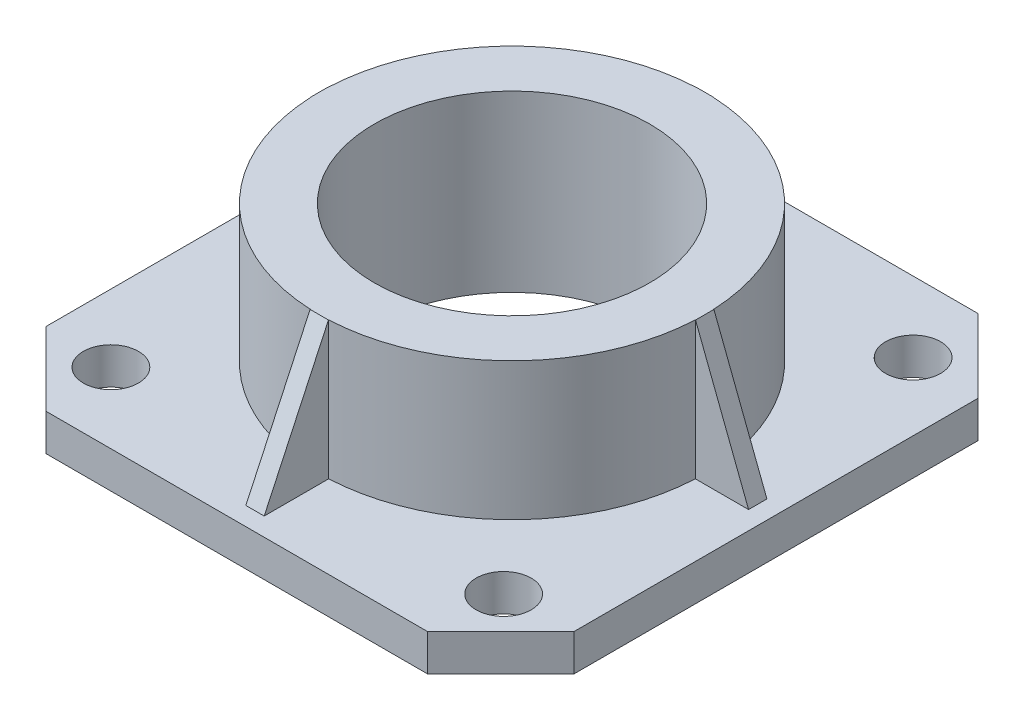
ISO-10303-21;
HEADER;
FILE_DESCRIPTION(('STEP AP214'),'2;1');
FILE_NAME('part.step','',(''),(''),'','','');
FILE_SCHEMA(('AUTOMOTIVE_DESIGN { 1 0 10303 214 1 1 1 1 }'));
ENDSEC;
DATA;
#1=APPLICATION_CONTEXT('core data for automotive mechanical design processes');
#2=APPLICATION_PROTOCOL_DEFINITION('international standard','automotive_design',2000,#1);
#3=PRODUCT_CONTEXT('',#1,'mechanical');
#4=PRODUCT('Part','Part','',(#3));
#5=PRODUCT_RELATED_PRODUCT_CATEGORY('part','',(#4));
#6=PRODUCT_DEFINITION_FORMATION('','',#4);
#7=PRODUCT_DEFINITION_CONTEXT('part definition',#1,'design');
#8=PRODUCT_DEFINITION('design','',#6,#7);
#9=PRODUCT_DEFINITION_SHAPE('','',#8);
#10=(LENGTH_UNIT() NAMED_UNIT(*) SI_UNIT(.MILLI.,.METRE.));
#11=(NAMED_UNIT(*) PLANE_ANGLE_UNIT() SI_UNIT($,.RADIAN.));
#12=(NAMED_UNIT(*) SI_UNIT($,.STERADIAN.) SOLID_ANGLE_UNIT());
#13=UNCERTAINTY_MEASURE_WITH_UNIT(LENGTH_MEASURE(1.E-05),#10,'distance_accuracy_value','');
#14=(GEOMETRIC_REPRESENTATION_CONTEXT(3) GLOBAL_UNCERTAINTY_ASSIGNED_CONTEXT((#13)) GLOBAL_UNIT_ASSIGNED_CONTEXT((#10,
#11,#12)) REPRESENTATION_CONTEXT('',''));
#15=CARTESIAN_POINT('',(0.,0.,0.));
#16=DIRECTION('',(0.,0.,1.));
#17=DIRECTION('',(1.,0.,0.));
#18=AXIS2_PLACEMENT_3D('',#15,#16,#17);
#19=CARTESIAN_POINT('',(0.,9.5,0.));
#20=DIRECTION('',(0.,-1.,0.));
#21=DIRECTION('',(0.,0.,-1.));
#22=AXIS2_PLACEMENT_3D('',#19,#20,#21);
#23=CYLINDRICAL_SURFACE('',#22,10.5);
#24=DIRECTION('',(0.,-1.,0.));
#25=VECTOR('',#24,1.);
#26=CARTESIAN_POINT('',(10.4880884817015,9.5,-0.5));
#27=LINE('',#26,#25);
#28=CARTESIAN_POINT('',(10.4880884817015,2.,-0.5));
#29=VERTEX_POINT('',#28);
#30=CARTESIAN_POINT('',(10.4880884817015,9.5,-0.5));
#31=VERTEX_POINT('',#30);
#32=EDGE_CURVE('E219',#29,#31,#27,.F.);
#33=ORIENTED_EDGE('',*,*,#32,.F.);
#34=CARTESIAN_POINT('',(0.,2.,0.));
#35=DIRECTION('',(0.,-1.,0.));
#36=DIRECTION('',(0.,0.,-1.));
#37=AXIS2_PLACEMENT_3D('',#34,#35,#36);
#38=CIRCLE('',#37,10.5);
#39=CARTESIAN_POINT('',(0.5,2.,-10.4880884817015));
#40=VERTEX_POINT('',#39);
#41=EDGE_CURVE('E390',#29,#40,#38,.F.);
#42=ORIENTED_EDGE('',*,*,#41,.T.);
#43=DIRECTION('',(0.,-1.,0.));
#44=VECTOR('',#43,1.);
#45=CARTESIAN_POINT('',(0.5,9.5,-10.4880884817015));
#46=LINE('',#45,#44);
#47=CARTESIAN_POINT('',(0.5,9.5,-10.4880884817015));
#48=VERTEX_POINT('',#47);
#49=EDGE_CURVE('E41',#40,#48,#46,.F.);
#50=ORIENTED_EDGE('',*,*,#49,.T.);
#51=CARTESIAN_POINT('',(0.,9.5,0.));
#52=DIRECTION('',(0.,1.,0.));
#53=DIRECTION('',(0.,0.,1.));
#54=AXIS2_PLACEMENT_3D('',#51,#52,#53);
#55=CIRCLE('',#54,10.5);
#56=EDGE_CURVE('E299',#31,#48,#55,.T.);
#57=ORIENTED_EDGE('',*,*,#56,.F.);
#58=EDGE_LOOP('',(#33,#42,#50,#57));
#59=FACE_BOUND('',#58,.T.);
#60=ADVANCED_FACE('F33',(#59),#23,.T.);
#61=CARTESIAN_POINT('',(-14.3876477930347,2.,-15.));
#62=DIRECTION('',(0.,-1.,0.));
#63=DIRECTION('',(0.,0.,-1.));
#64=AXIS2_PLACEMENT_3D('',#61,#62,#63);
#65=PLANE('',#64);
#66=CARTESIAN_POINT('',(10.6983900295492,2.,11.1537238575528));
#67=DIRECTION('',(0.,1.,0.));
#68=DIRECTION('',(0.,0.,1.));
#69=AXIS2_PLACEMENT_3D('',#66,#67,#68);
#70=CIRCLE('',#69,1.5);
#71=CARTESIAN_POINT('',(10.6983900295492,2.,12.6537238575528));
#72=VERTEX_POINT('',#71);
#73=EDGE_CURVE('E306',#72,#72,#70,.T.);
#74=ORIENTED_EDGE('',*,*,#73,.F.);
#75=EDGE_LOOP('',(#74));
#76=FACE_BOUND('',#75,.T.);
#77=CARTESIAN_POINT('',(-10.6983900295492,2.,-11.1537238575528));
#78=DIRECTION('',(0.,1.,0.));
#79=DIRECTION('',(0.,0.,1.));
#80=AXIS2_PLACEMENT_3D('',#77,#78,#79);
#81=CIRCLE('',#80,1.5);
#82=CARTESIAN_POINT('',(-10.6983900295492,2.,-9.65372385755277));
#83=VERTEX_POINT('',#82);
#84=EDGE_CURVE('E318',#83,#83,#81,.T.);
#85=ORIENTED_EDGE('',*,*,#84,.F.);
#86=EDGE_LOOP('',(#85));
#87=FACE_BOUND('',#86,.T.);
#88=DIRECTION('',(0.,0.,1.));
#89=VECTOR('',#88,1.);
#90=CARTESIAN_POINT('',(-14.3876477930347,2.,11.));
#91=LINE('',#90,#89);
#92=CARTESIAN_POINT('',(-14.3876477930347,2.,-11.));
#93=VERTEX_POINT('',#92);
#94=CARTESIAN_POINT('',(-14.3876477930347,2.,11.));
#95=VERTEX_POINT('',#94);
#96=EDGE_CURVE('E333',#93,#95,#91,.T.);
#97=ORIENTED_EDGE('',*,*,#96,.T.);
#98=DIRECTION('',(0.707106781186548,0.,0.707106781186548));
#99=VECTOR('',#98,1.);
#100=CARTESIAN_POINT('',(-14.3876477930347,2.,11.));
#101=LINE('',#100,#99);
#102=CARTESIAN_POINT('',(-10.3876477930347,2.,15.));
#103=VERTEX_POINT('',#102);
#104=EDGE_CURVE('E336',#95,#103,#101,.T.);
#105=ORIENTED_EDGE('',*,*,#104,.T.);
#106=DIRECTION('',(1.,0.,0.));
#107=VECTOR('',#106,1.);
#108=CARTESIAN_POINT('',(-10.3876477930347,2.,15.));
#109=LINE('',#108,#107);
#110=CARTESIAN_POINT('',(10.3876477930347,2.,15.));
#111=VERTEX_POINT('',#110);
#112=EDGE_CURVE('E339',#103,#111,#109,.T.);
#113=ORIENTED_EDGE('',*,*,#112,.T.);
#114=DIRECTION('',(0.707106781186548,0.,-0.707106781186548));
#115=VECTOR('',#114,1.);
#116=CARTESIAN_POINT('',(10.3876477930347,2.,15.));
#117=LINE('',#116,#115);
#118=CARTESIAN_POINT('',(14.3876477930347,2.,11.));
#119=VERTEX_POINT('',#118);
#120=EDGE_CURVE('E341',#111,#119,#117,.T.);
#121=ORIENTED_EDGE('',*,*,#120,.T.);
#122=DIRECTION('',(0.,0.,-1.));
#123=VECTOR('',#122,1.);
#124=CARTESIAN_POINT('',(14.3876477930347,2.,11.));
#125=LINE('',#124,#123);
#126=CARTESIAN_POINT('',(14.3876477930347,2.,-11.));
#127=VERTEX_POINT('',#126);
#128=EDGE_CURVE('E343',#119,#127,#125,.T.);
#129=ORIENTED_EDGE('',*,*,#128,.T.);
#130=DIRECTION('',(-0.707106781186548,0.,-0.707106781186548));
#131=VECTOR('',#130,1.);
#132=CARTESIAN_POINT('',(10.3876477930347,2.,-15.));
#133=LINE('',#132,#131);
#134=CARTESIAN_POINT('',(10.3876477930347,2.,-15.));
#135=VERTEX_POINT('',#134);
#136=EDGE_CURVE('E345',#127,#135,#133,.T.);
#137=ORIENTED_EDGE('',*,*,#136,.T.);
#138=DIRECTION('',(-1.,0.,0.));
#139=VECTOR('',#138,1.);
#140=CARTESIAN_POINT('',(-10.3876477930347,2.,-15.));
#141=LINE('',#140,#139);
#142=CARTESIAN_POINT('',(-10.3876477930347,2.,-15.));
#143=VERTEX_POINT('',#142);
#144=EDGE_CURVE('E347',#135,#143,#141,.T.);
#145=ORIENTED_EDGE('',*,*,#144,.T.);
#146=DIRECTION('',(-0.707106781186548,0.,0.707106781186547));
#147=VECTOR('',#146,1.);
#148=CARTESIAN_POINT('',(-14.3876477930347,2.,-11.));
#149=LINE('',#148,#147);
#150=EDGE_CURVE('E349',#143,#93,#149,.T.);
#151=ORIENTED_EDGE('',*,*,#150,.T.);
#152=EDGE_LOOP('',(#97,#105,#113,#121,#129,#137,#145,#151));
#153=FACE_BOUND('',#152,.T.);
#154=CARTESIAN_POINT('',(-10.6983900295492,2.,11.1537238575528));
#155=DIRECTION('',(0.,1.,0.));
#156=DIRECTION('',(0.,0.,1.));
#157=AXIS2_PLACEMENT_3D('',#154,#155,#156);
#158=CIRCLE('',#157,1.5);
#159=CARTESIAN_POINT('',(-10.6983900295492,2.,12.6537238575528));
#160=VERTEX_POINT('',#159);
#161=EDGE_CURVE('E324',#160,#160,#158,.T.);
#162=ORIENTED_EDGE('',*,*,#161,.F.);
#163=EDGE_LOOP('',(#162));
#164=FACE_BOUND('',#163,.T.);
#165=CARTESIAN_POINT('',(10.6983900295492,2.,-11.1537238575528));
#166=DIRECTION('',(0.,1.,0.));
#167=DIRECTION('',(0.,0.,1.));
#168=AXIS2_PLACEMENT_3D('',#165,#166,#167);
#169=CIRCLE('',#168,1.5);
#170=CARTESIAN_POINT('',(10.6983900295492,2.,-9.65372385755277));
#171=VERTEX_POINT('',#170);
#172=EDGE_CURVE('E312',#171,#171,#169,.T.);
#173=ORIENTED_EDGE('',*,*,#172,.F.);
#174=EDGE_LOOP('',(#173));
#175=FACE_BOUND('',#174,.T.);
#176=DIRECTION('',(1.,0.,0.));
#177=VECTOR('',#176,1.);
#178=CARTESIAN_POINT('',(13.3876477930347,2.,-0.5));
#179=LINE('',#178,#177);
#180=CARTESIAN_POINT('',(13.3876477930347,2.,-0.5));
#181=VERTEX_POINT('',#180);
#182=EDGE_CURVE('E212',#29,#181,#179,.T.);
#183=ORIENTED_EDGE('',*,*,#182,.T.);
#184=DIRECTION('',(0.,0.,1.));
#185=VECTOR('',#184,1.);
#186=CARTESIAN_POINT('',(13.3876477930347,2.,-0.5));
#187=LINE('',#186,#185);
#188=CARTESIAN_POINT('',(13.3876477930347,2.,0.5));
#189=VERTEX_POINT('',#188);
#190=EDGE_CURVE('E204',#181,#189,#187,.T.);
#191=ORIENTED_EDGE('',*,*,#190,.T.);
#192=DIRECTION('',(1.,0.,0.));
#193=VECTOR('',#192,1.);
#194=CARTESIAN_POINT('',(13.3876477930347,2.,0.5));
#195=LINE('',#194,#193);
#196=CARTESIAN_POINT('',(10.4880884817015,2.,0.5));
#197=VERTEX_POINT('',#196);
#198=EDGE_CURVE('E191',#197,#189,#195,.T.);
#199=ORIENTED_EDGE('',*,*,#198,.F.);
#200=CARTESIAN_POINT('',(0.5,2.,10.4880884817015));
#201=VERTEX_POINT('',#200);
#202=EDGE_CURVE('E394',#201,#197,#38,.F.);
#203=ORIENTED_EDGE('',*,*,#202,.F.);
#204=DIRECTION('',(0.,0.,-1.));
#205=VECTOR('',#204,1.);
#206=CARTESIAN_POINT('',(0.5,2.,7.50000000000001));
#207=LINE('',#206,#205);
#208=CARTESIAN_POINT('',(0.5,2.,14.));
#209=VERTEX_POINT('',#208);
#210=EDGE_CURVE('E248',#209,#201,#207,.T.);
#211=ORIENTED_EDGE('',*,*,#210,.F.);
#212=DIRECTION('',(1.,0.,0.));
#213=VECTOR('',#212,1.);
#214=CARTESIAN_POINT('',(-0.5,2.,14.));
#215=LINE('',#214,#213);
#216=CARTESIAN_POINT('',(-0.5,2.,14.));
#217=VERTEX_POINT('',#216);
#218=EDGE_CURVE('E263',#217,#209,#215,.T.);
#219=ORIENTED_EDGE('',*,*,#218,.F.);
#220=DIRECTION('',(0.,0.,-1.));
#221=VECTOR('',#220,1.);
#222=CARTESIAN_POINT('',(-0.5,2.,7.50000000000001));
#223=LINE('',#222,#221);
#224=CARTESIAN_POINT('',(-0.5,2.,10.4880884817015));
#225=VERTEX_POINT('',#224);
#226=EDGE_CURVE('E257',#217,#225,#223,.T.);
#227=ORIENTED_EDGE('',*,*,#226,.T.);
#228=CARTESIAN_POINT('',(-10.4880884817015,2.,0.5));
#229=VERTEX_POINT('',#228);
#230=EDGE_CURVE('E393',#229,#225,#38,.F.);
#231=ORIENTED_EDGE('',*,*,#230,.F.);
#232=DIRECTION('',(1.,0.,0.));
#233=VECTOR('',#232,1.);
#234=CARTESIAN_POINT('',(-13.3876477930347,2.,0.5));
#235=LINE('',#234,#233);
#236=CARTESIAN_POINT('',(-13.3876477930347,2.,0.5));
#237=VERTEX_POINT('',#236);
#238=EDGE_CURVE('E227',#237,#229,#235,.T.);
#239=ORIENTED_EDGE('',*,*,#238,.F.);
#240=DIRECTION('',(0.,0.,1.));
#241=VECTOR('',#240,1.);
#242=CARTESIAN_POINT('',(-13.3876477930347,2.,-0.5));
#243=LINE('',#242,#241);
#244=CARTESIAN_POINT('',(-13.3876477930347,2.,-0.5));
#245=VERTEX_POINT('',#244);
#246=EDGE_CURVE('E56',#245,#237,#243,.T.);
#247=ORIENTED_EDGE('',*,*,#246,.F.);
#248=DIRECTION('',(1.,0.,0.));
#249=VECTOR('',#248,1.);
#250=CARTESIAN_POINT('',(-13.3876477930347,2.,-0.5));
#251=LINE('',#250,#249);
#252=CARTESIAN_POINT('',(-10.4880884817015,2.,-0.5));
#253=VERTEX_POINT('',#252);
#254=EDGE_CURVE('E235',#245,#253,#251,.T.);
#255=ORIENTED_EDGE('',*,*,#254,.T.);
#256=CARTESIAN_POINT('',(-0.5,2.,-10.4880884817015));
#257=VERTEX_POINT('',#256);
#258=EDGE_CURVE('E391',#257,#253,#38,.F.);
#259=ORIENTED_EDGE('',*,*,#258,.F.);
#260=DIRECTION('',(0.,0.,-1.));
#261=VECTOR('',#260,1.);
#262=CARTESIAN_POINT('',(-0.5,2.,-14.));
#263=LINE('',#262,#261);
#264=CARTESIAN_POINT('',(-0.5,2.,-14.));
#265=VERTEX_POINT('',#264);
#266=EDGE_CURVE('E285',#257,#265,#263,.T.);
#267=ORIENTED_EDGE('',*,*,#266,.T.);
#268=DIRECTION('',(1.,0.,0.));
#269=VECTOR('',#268,1.);
#270=CARTESIAN_POINT('',(-0.5,2.,-14.));
#271=LINE('',#270,#269);
#272=CARTESIAN_POINT('',(0.5,2.,-14.));
#273=VERTEX_POINT('',#272);
#274=EDGE_CURVE('E291',#265,#273,#271,.T.);
#275=ORIENTED_EDGE('',*,*,#274,.T.);
#276=DIRECTION('',(0.,0.,-1.));
#277=VECTOR('',#276,1.);
#278=CARTESIAN_POINT('',(0.5,2.,-14.));
#279=LINE('',#278,#277);
#280=EDGE_CURVE('E277',#40,#273,#279,.T.);
#281=ORIENTED_EDGE('',*,*,#280,.F.);
#282=ORIENTED_EDGE('',*,*,#41,.F.);
#283=EDGE_LOOP('',(#183,#191,#199,#203,#211,#219,#227,#231,#239,#247,#255,#259,#267,#275,#281,#282));
#284=FACE_BOUND('',#283,.T.);
#285=ADVANCED_FACE('F210',(#76,#87,#153,#164,#175,#284),#65,.F.);
#286=DIRECTION('',(0.,-1.,0.));
#287=VECTOR('',#286,1.);
#288=CARTESIAN_POINT('',(-10.4880884817015,9.5,0.5));
#289=LINE('',#288,#287);
#290=CARTESIAN_POINT('',(-10.4880884817015,9.5,0.5));
#291=VERTEX_POINT('',#290);
#292=EDGE_CURVE('E239',#229,#291,#289,.F.);
#293=ORIENTED_EDGE('',*,*,#292,.F.);
#294=ORIENTED_EDGE('',*,*,#230,.T.);
#295=DIRECTION('',(0.,-1.,0.));
#296=VECTOR('',#295,1.);
#297=CARTESIAN_POINT('',(-0.5,9.5,10.4880884817015));
#298=LINE('',#297,#296);
#299=CARTESIAN_POINT('',(-0.5,9.5,10.4880884817015));
#300=VERTEX_POINT('',#299);
#301=EDGE_CURVE('E271',#225,#300,#298,.F.);
#302=ORIENTED_EDGE('',*,*,#301,.T.);
#303=EDGE_CURVE('E304',#291,#300,#55,.T.);
#304=ORIENTED_EDGE('',*,*,#303,.F.);
#305=EDGE_LOOP('',(#293,#294,#302,#304));
#306=FACE_BOUND('',#305,.T.);
#307=ADVANCED_FACE('F435',(#306),#23,.T.);
#308=ORIENTED_EDGE('',*,*,#202,.T.);
#309=DIRECTION('',(0.,-1.,0.));
#310=VECTOR('',#309,1.);
#311=CARTESIAN_POINT('',(10.4880884817015,9.5,0.5));
#312=LINE('',#311,#310);
#313=CARTESIAN_POINT('',(10.4880884817015,9.5,0.5));
#314=VERTEX_POINT('',#313);
#315=EDGE_CURVE('E48',#197,#314,#312,.F.);
#316=ORIENTED_EDGE('',*,*,#315,.T.);
#317=CARTESIAN_POINT('',(0.5,9.5,10.4880884817015));
#318=VERTEX_POINT('',#317);
#319=EDGE_CURVE('E305',#318,#314,#55,.T.);
#320=ORIENTED_EDGE('',*,*,#319,.F.);
#321=DIRECTION('',(0.,-1.,0.));
#322=VECTOR('',#321,1.);
#323=CARTESIAN_POINT('',(0.5,9.5,10.4880884817015));
#324=LINE('',#323,#322);
#325=EDGE_CURVE('E266',#201,#318,#324,.F.);
#326=ORIENTED_EDGE('',*,*,#325,.F.);
#327=EDGE_LOOP('',(#308,#316,#320,#326));
#328=FACE_BOUND('',#327,.T.);
#329=ADVANCED_FACE('F447',(#328),#23,.T.);
#330=ORIENTED_EDGE('',*,*,#258,.T.);
#331=DIRECTION('',(0.,-1.,0.));
#332=VECTOR('',#331,1.);
#333=CARTESIAN_POINT('',(-10.4880884817015,9.5,-0.5));
#334=LINE('',#333,#332);
#335=CARTESIAN_POINT('',(-10.4880884817015,9.5,-0.5));
#336=VERTEX_POINT('',#335);
#337=EDGE_CURVE('E243',#253,#336,#334,.F.);
#338=ORIENTED_EDGE('',*,*,#337,.T.);
#339=CARTESIAN_POINT('',(-0.5,9.5,-10.4880884817015));
#340=VERTEX_POINT('',#339);
#341=EDGE_CURVE('E300',#340,#336,#55,.T.);
#342=ORIENTED_EDGE('',*,*,#341,.F.);
#343=DIRECTION('',(0.,-1.,0.));
#344=VECTOR('',#343,1.);
#345=CARTESIAN_POINT('',(-0.5,9.5,-10.4880884817015));
#346=LINE('',#345,#344);
#347=EDGE_CURVE('E11',#257,#340,#346,.F.);
#348=ORIENTED_EDGE('',*,*,#347,.F.);
#349=EDGE_LOOP('',(#330,#338,#342,#348));
#350=FACE_BOUND('',#349,.T.);
#351=ADVANCED_FACE('F419',(#350),#23,.T.);
#352=CARTESIAN_POINT('',(-14.3876477930347,0.,-15.));
#353=DIRECTION('',(0.,-1.,0.));
#354=DIRECTION('',(0.,0.,-1.));
#355=AXIS2_PLACEMENT_3D('',#352,#353,#354);
#356=PLANE('',#355);
#357=CARTESIAN_POINT('',(10.6983900295492,0.,-11.1537238575528));
#358=DIRECTION('',(0.,1.,0.));
#359=DIRECTION('',(0.,0.,1.));
#360=AXIS2_PLACEMENT_3D('',#357,#358,#359);
#361=CIRCLE('',#360,1.5);
#362=CARTESIAN_POINT('',(10.6983900295492,0.,-9.65372385755277));
#363=VERTEX_POINT('',#362);
#364=EDGE_CURVE('E309',#363,#363,#361,.T.);
#365=ORIENTED_EDGE('',*,*,#364,.T.);
#366=EDGE_LOOP('',(#365));
#367=FACE_BOUND('',#366,.T.);
#368=CARTESIAN_POINT('',(-10.6983900295492,0.,11.1537238575528));
#369=DIRECTION('',(0.,1.,0.));
#370=DIRECTION('',(0.,0.,1.));
#371=AXIS2_PLACEMENT_3D('',#368,#369,#370);
#372=CIRCLE('',#371,1.5);
#373=CARTESIAN_POINT('',(-10.6983900295492,0.,12.6537238575528));
#374=VERTEX_POINT('',#373);
#375=EDGE_CURVE('E321',#374,#374,#372,.T.);
#376=ORIENTED_EDGE('',*,*,#375,.T.);
#377=EDGE_LOOP('',(#376));
#378=FACE_BOUND('',#377,.T.);
#379=DIRECTION('',(0.,0.,1.));
#380=VECTOR('',#379,1.);
#381=CARTESIAN_POINT('',(-14.3876477930347,0.,11.));
#382=LINE('',#381,#380);
#383=CARTESIAN_POINT('',(-14.3876477930347,0.,-11.));
#384=VERTEX_POINT('',#383);
#385=CARTESIAN_POINT('',(-14.3876477930347,0.,11.));
#386=VERTEX_POINT('',#385);
#387=EDGE_CURVE('E332',#384,#386,#382,.T.);
#388=ORIENTED_EDGE('',*,*,#387,.F.);
#389=DIRECTION('',(-0.707106781186548,0.,0.707106781186547));
#390=VECTOR('',#389,1.);
#391=CARTESIAN_POINT('',(-14.3876477930347,0.,-11.));
#392=LINE('',#391,#390);
#393=CARTESIAN_POINT('',(-10.3876477930347,0.,-15.));
#394=VERTEX_POINT('',#393);
#395=EDGE_CURVE('E337',#394,#384,#392,.T.);
#396=ORIENTED_EDGE('',*,*,#395,.F.);
#397=DIRECTION('',(-1.,0.,0.));
#398=VECTOR('',#397,1.);
#399=CARTESIAN_POINT('',(-10.3876477930347,0.,-15.));
#400=LINE('',#399,#398);
#401=CARTESIAN_POINT('',(10.3876477930347,0.,-15.));
#402=VERTEX_POINT('',#401);
#403=EDGE_CURVE('E364',#402,#394,#400,.T.);
#404=ORIENTED_EDGE('',*,*,#403,.F.);
#405=DIRECTION('',(-0.707106781186548,0.,-0.707106781186548));
#406=VECTOR('',#405,1.);
#407=CARTESIAN_POINT('',(10.3876477930347,0.,-15.));
#408=LINE('',#407,#406);
#409=CARTESIAN_POINT('',(14.3876477930347,0.,-11.));
#410=VERTEX_POINT('',#409);
#411=EDGE_CURVE('E362',#410,#402,#408,.T.);
#412=ORIENTED_EDGE('',*,*,#411,.F.);
#413=DIRECTION('',(0.,0.,-1.));
#414=VECTOR('',#413,1.);
#415=CARTESIAN_POINT('',(14.3876477930347,0.,11.));
#416=LINE('',#415,#414);
#417=CARTESIAN_POINT('',(14.3876477930347,0.,11.));
#418=VERTEX_POINT('',#417);
#419=EDGE_CURVE('E360',#418,#410,#416,.T.);
#420=ORIENTED_EDGE('',*,*,#419,.F.);
#421=DIRECTION('',(0.707106781186548,0.,-0.707106781186548));
#422=VECTOR('',#421,1.);
#423=CARTESIAN_POINT('',(10.3876477930347,0.,15.));
#424=LINE('',#423,#422);
#425=CARTESIAN_POINT('',(10.3876477930347,0.,15.));
#426=VERTEX_POINT('',#425);
#427=EDGE_CURVE('E358',#426,#418,#424,.T.);
#428=ORIENTED_EDGE('',*,*,#427,.F.);
#429=DIRECTION('',(1.,0.,0.));
#430=VECTOR('',#429,1.);
#431=CARTESIAN_POINT('',(-10.3876477930347,0.,15.));
#432=LINE('',#431,#430);
#433=CARTESIAN_POINT('',(-10.3876477930347,0.,15.));
#434=VERTEX_POINT('',#433);
#435=EDGE_CURVE('E356',#434,#426,#432,.T.);
#436=ORIENTED_EDGE('',*,*,#435,.F.);
#437=DIRECTION('',(0.707106781186548,0.,0.707106781186548));
#438=VECTOR('',#437,1.);
#439=CARTESIAN_POINT('',(-14.3876477930347,0.,11.));
#440=LINE('',#439,#438);
#441=EDGE_CURVE('E354',#386,#434,#440,.T.);
#442=ORIENTED_EDGE('',*,*,#441,.F.);
#443=EDGE_LOOP('',(#388,#396,#404,#412,#420,#428,#436,#442));
#444=FACE_BOUND('',#443,.T.);
#445=CARTESIAN_POINT('',(0.,0.,0.));
#446=DIRECTION('',(0.,1.,0.));
#447=DIRECTION('',(0.,0.,1.));
#448=AXIS2_PLACEMENT_3D('',#445,#446,#447);
#449=CIRCLE('',#448,7.5);
#450=CARTESIAN_POINT('',(0.,0.,7.50000000000001));
#451=VERTEX_POINT('',#450);
#452=EDGE_CURVE('E327',#451,#451,#449,.T.);
#453=ORIENTED_EDGE('',*,*,#452,.T.);
#454=EDGE_LOOP('',(#453));
#455=FACE_BOUND('',#454,.T.);
#456=CARTESIAN_POINT('',(-10.6983900295492,0.,-11.1537238575528));
#457=DIRECTION('',(0.,1.,0.));
#458=DIRECTION('',(0.,0.,1.));
#459=AXIS2_PLACEMENT_3D('',#456,#457,#458);
#460=CIRCLE('',#459,1.5);
#461=CARTESIAN_POINT('',(-10.6983900295492,0.,-9.65372385755277));
#462=VERTEX_POINT('',#461);
#463=EDGE_CURVE('E315',#462,#462,#460,.T.);
#464=ORIENTED_EDGE('',*,*,#463,.T.);
#465=EDGE_LOOP('',(#464));
#466=FACE_BOUND('',#465,.T.);
#467=CARTESIAN_POINT('',(10.6983900295492,0.,11.1537238575528));
#468=DIRECTION('',(0.,1.,0.));
#469=DIRECTION('',(0.,0.,1.));
#470=AXIS2_PLACEMENT_3D('',#467,#468,#469);
#471=CIRCLE('',#470,1.5);
#472=CARTESIAN_POINT('',(10.6983900295492,0.,12.6537238575528));
#473=VERTEX_POINT('',#472);
#474=EDGE_CURVE('E303',#473,#473,#471,.T.);
#475=ORIENTED_EDGE('',*,*,#474,.T.);
#476=EDGE_LOOP('',(#475));
#477=FACE_BOUND('',#476,.T.);
#478=ADVANCED_FACE('F475',(#367,#378,#444,#455,#466,#477),#356,.T.);
#479=CARTESIAN_POINT('',(-14.3876477930347,2.,11.));
#480=DIRECTION('',(1.,0.,0.));
#481=DIRECTION('',(0.,0.,-1.));
#482=AXIS2_PLACEMENT_3D('',#479,#480,#481);
#483=PLANE('',#482);
#484=ORIENTED_EDGE('',*,*,#387,.T.);
#485=DIRECTION('',(0.,-1.,0.));
#486=VECTOR('',#485,1.);
#487=CARTESIAN_POINT('',(-14.3876477930347,2.,11.));
#488=LINE('',#487,#486);
#489=EDGE_CURVE('E387',#95,#386,#488,.T.);
#490=ORIENTED_EDGE('',*,*,#489,.F.);
#491=ORIENTED_EDGE('',*,*,#96,.F.);
#492=DIRECTION('',(0.,-1.,0.));
#493=VECTOR('',#492,1.);
#494=CARTESIAN_POINT('',(-14.3876477930347,2.,-11.));
#495=LINE('',#494,#493);
#496=EDGE_CURVE('E351',#93,#384,#495,.T.);
#497=ORIENTED_EDGE('',*,*,#496,.T.);
#498=EDGE_LOOP('',(#484,#490,#491,#497));
#499=FACE_BOUND('',#498,.T.);
#500=ADVANCED_FACE('F35',(#499),#483,.F.);
#501=CARTESIAN_POINT('',(-14.3876477930347,2.,11.));
#502=DIRECTION('',(0.707106781186547,0.,-0.707106781186547));
#503=DIRECTION('',(-0.707106781186548,0.,-0.707106781186548));
#504=AXIS2_PLACEMENT_3D('',#501,#502,#503);
#505=PLANE('',#504);
#506=ORIENTED_EDGE('',*,*,#441,.T.);
#507=DIRECTION('',(0.,-1.,0.));
#508=VECTOR('',#507,1.);
#509=CARTESIAN_POINT('',(-10.3876477930347,2.,15.));
#510=LINE('',#509,#508);
#511=EDGE_CURVE('E384',#103,#434,#510,.T.);
#512=ORIENTED_EDGE('',*,*,#511,.F.);
#513=ORIENTED_EDGE('',*,*,#104,.F.);
#514=ORIENTED_EDGE('',*,*,#489,.T.);
#515=EDGE_LOOP('',(#506,#512,#513,#514));
#516=FACE_BOUND('',#515,.T.);
#517=ADVANCED_FACE('F651',(#516),#505,.F.);
#518=CARTESIAN_POINT('',(-10.3876477930347,2.,15.));
#519=DIRECTION('',(0.,0.,-1.));
#520=DIRECTION('',(-1.,0.,0.));
#521=AXIS2_PLACEMENT_3D('',#518,#519,#520);
#522=PLANE('',#521);
#523=ORIENTED_EDGE('',*,*,#435,.T.);
#524=DIRECTION('',(0.,-1.,0.));
#525=VECTOR('',#524,1.);
#526=CARTESIAN_POINT('',(10.3876477930347,2.,15.));
#527=LINE('',#526,#525);
#528=EDGE_CURVE('E381',#111,#426,#527,.T.);
#529=ORIENTED_EDGE('',*,*,#528,.F.);
#530=ORIENTED_EDGE('',*,*,#112,.F.);
#531=ORIENTED_EDGE('',*,*,#511,.T.);
#532=EDGE_LOOP('',(#523,#529,#530,#531));
#533=FACE_BOUND('',#532,.T.);
#534=ADVANCED_FACE('F641',(#533),#522,.F.);
#535=CARTESIAN_POINT('',(10.3876477930347,2.,15.));
#536=DIRECTION('',(-0.707106781186547,0.,-0.707106781186547));
#537=DIRECTION('',(-0.707106781186548,0.,0.707106781186548));
#538=AXIS2_PLACEMENT_3D('',#535,#536,#537);
#539=PLANE('',#538);
#540=ORIENTED_EDGE('',*,*,#427,.T.);
#541=DIRECTION('',(0.,-1.,0.));
#542=VECTOR('',#541,1.);
#543=CARTESIAN_POINT('',(14.3876477930347,2.,11.));
#544=LINE('',#543,#542);
#545=EDGE_CURVE('E378',#119,#418,#544,.T.);
#546=ORIENTED_EDGE('',*,*,#545,.F.);
#547=ORIENTED_EDGE('',*,*,#120,.F.);
#548=ORIENTED_EDGE('',*,*,#528,.T.);
#549=EDGE_LOOP('',(#540,#546,#547,#548));
#550=FACE_BOUND('',#549,.T.);
#551=ADVANCED_FACE('F631',(#550),#539,.F.);
#552=CARTESIAN_POINT('',(14.3876477930347,2.,11.));
#553=DIRECTION('',(-1.,0.,0.));
#554=DIRECTION('',(0.,0.,1.));
#555=AXIS2_PLACEMENT_3D('',#552,#553,#554);
#556=PLANE('',#555);
#557=ORIENTED_EDGE('',*,*,#419,.T.);
#558=DIRECTION('',(0.,-1.,0.));
#559=VECTOR('',#558,1.);
#560=CARTESIAN_POINT('',(14.3876477930347,2.,-11.));
#561=LINE('',#560,#559);
#562=EDGE_CURVE('E375',#127,#410,#561,.T.);
#563=ORIENTED_EDGE('',*,*,#562,.F.);
#564=ORIENTED_EDGE('',*,*,#128,.F.);
#565=ORIENTED_EDGE('',*,*,#545,.T.);
#566=EDGE_LOOP('',(#557,#563,#564,#565));
#567=FACE_BOUND('',#566,.T.);
#568=ADVANCED_FACE('F621',(#567),#556,.F.);
#569=CARTESIAN_POINT('',(10.3876477930347,2.,-15.));
#570=DIRECTION('',(-0.707106781186547,0.,0.707106781186547));
#571=DIRECTION('',(0.707106781186548,0.,0.707106781186548));
#572=AXIS2_PLACEMENT_3D('',#569,#570,#571);
#573=PLANE('',#572);
#574=ORIENTED_EDGE('',*,*,#411,.T.);
#575=DIRECTION('',(0.,-1.,0.));
#576=VECTOR('',#575,1.);
#577=CARTESIAN_POINT('',(10.3876477930347,2.,-15.));
#578=LINE('',#577,#576);
#579=EDGE_CURVE('E372',#135,#402,#578,.T.);
#580=ORIENTED_EDGE('',*,*,#579,.F.);
#581=ORIENTED_EDGE('',*,*,#136,.F.);
#582=ORIENTED_EDGE('',*,*,#562,.T.);
#583=EDGE_LOOP('',(#574,#580,#581,#582));
#584=FACE_BOUND('',#583,.T.);
#585=ADVANCED_FACE('F611',(#584),#573,.F.);
#586=CARTESIAN_POINT('',(-10.3876477930347,2.,-15.));
#587=DIRECTION('',(0.,0.,1.));
#588=DIRECTION('',(1.,0.,0.));
#589=AXIS2_PLACEMENT_3D('',#586,#587,#588);
#590=PLANE('',#589);
#591=ORIENTED_EDGE('',*,*,#403,.T.);
#592=DIRECTION('',(0.,-1.,0.));
#593=VECTOR('',#592,1.);
#594=CARTESIAN_POINT('',(-10.3876477930347,2.,-15.));
#595=LINE('',#594,#593);
#596=EDGE_CURVE('E369',#143,#394,#595,.T.);
#597=ORIENTED_EDGE('',*,*,#596,.F.);
#598=ORIENTED_EDGE('',*,*,#144,.F.);
#599=ORIENTED_EDGE('',*,*,#579,.T.);
#600=EDGE_LOOP('',(#591,#597,#598,#599));
#601=FACE_BOUND('',#600,.T.);
#602=ADVANCED_FACE('F601',(#601),#590,.F.);
#603=CARTESIAN_POINT('',(-14.3876477930347,2.,-11.));
#604=DIRECTION('',(0.707106781186547,0.,0.707106781186548));
#605=DIRECTION('',(0.707106781186548,0.,-0.707106781186547));
#606=AXIS2_PLACEMENT_3D('',#603,#604,#605);
#607=PLANE('',#606);
#608=ORIENTED_EDGE('',*,*,#395,.T.);
#609=ORIENTED_EDGE('',*,*,#496,.F.);
#610=ORIENTED_EDGE('',*,*,#150,.F.);
#611=ORIENTED_EDGE('',*,*,#596,.T.);
#612=EDGE_LOOP('',(#608,#609,#610,#611));
#613=FACE_BOUND('',#612,.T.);
#614=ADVANCED_FACE('F596',(#613),#607,.F.);
#615=CARTESIAN_POINT('',(0.,2.,0.));
#616=DIRECTION('',(0.,-1.,0.));
#617=DIRECTION('',(0.,0.,-1.));
#618=AXIS2_PLACEMENT_3D('',#615,#616,#617);
#619=CYLINDRICAL_SURFACE('',#618,7.5);
#620=ORIENTED_EDGE('',*,*,#452,.F.);
#621=EDGE_LOOP('',(#620));
#622=FACE_BOUND('',#621,.T.);
#623=CARTESIAN_POINT('',(0.,9.5,0.));
#624=DIRECTION('',(0.,1.,0.));
#625=DIRECTION('',(0.,0.,1.));
#626=AXIS2_PLACEMENT_3D('',#623,#624,#625);
#627=CIRCLE('',#626,7.5);
#628=CARTESIAN_POINT('',(0.,9.5,7.5));
#629=VERTEX_POINT('',#628);
#630=EDGE_CURVE('E294',#629,#629,#627,.T.);
#631=ORIENTED_EDGE('',*,*,#630,.T.);
#632=EDGE_LOOP('',(#631));
#633=FACE_BOUND('',#632,.T.);
#634=ADVANCED_FACE('F588',(#622,#633),#619,.F.);
#635=CARTESIAN_POINT('',(-10.6983900295492,2.,11.1537238575528));
#636=DIRECTION('',(0.,-1.,0.));
#637=DIRECTION('',(0.,0.,-1.));
#638=AXIS2_PLACEMENT_3D('',#635,#636,#637);
#639=CYLINDRICAL_SURFACE('',#638,1.5);
#640=ORIENTED_EDGE('',*,*,#161,.T.);
#641=EDGE_LOOP('',(#640));
#642=FACE_BOUND('',#641,.T.);
#643=ORIENTED_EDGE('',*,*,#375,.F.);
#644=EDGE_LOOP('',(#643));
#645=FACE_BOUND('',#644,.T.);
#646=ADVANCED_FACE('F578',(#642,#645),#639,.F.);
#647=CARTESIAN_POINT('',(-10.6983900295492,2.,-11.1537238575528));
#648=DIRECTION('',(0.,-1.,0.));
#649=DIRECTION('',(0.,0.,-1.));
#650=AXIS2_PLACEMENT_3D('',#647,#648,#649);
#651=CYLINDRICAL_SURFACE('',#650,1.5);
#652=ORIENTED_EDGE('',*,*,#84,.T.);
#653=EDGE_LOOP('',(#652));
#654=FACE_BOUND('',#653,.T.);
#655=ORIENTED_EDGE('',*,*,#463,.F.);
#656=EDGE_LOOP('',(#655));
#657=FACE_BOUND('',#656,.T.);
#658=ADVANCED_FACE('F568',(#654,#657),#651,.F.);
#659=CARTESIAN_POINT('',(10.6983900295492,2.,-11.1537238575528));
#660=DIRECTION('',(0.,-1.,0.));
#661=DIRECTION('',(0.,0.,-1.));
#662=AXIS2_PLACEMENT_3D('',#659,#660,#661);
#663=CYLINDRICAL_SURFACE('',#662,1.5);
#664=ORIENTED_EDGE('',*,*,#172,.T.);
#665=EDGE_LOOP('',(#664));
#666=FACE_BOUND('',#665,.T.);
#667=ORIENTED_EDGE('',*,*,#364,.F.);
#668=EDGE_LOOP('',(#667));
#669=FACE_BOUND('',#668,.T.);
#670=ADVANCED_FACE('F558',(#666,#669),#663,.F.);
#671=CARTESIAN_POINT('',(10.6983900295492,2.,11.1537238575528));
#672=DIRECTION('',(0.,-1.,0.));
#673=DIRECTION('',(0.,0.,-1.));
#674=AXIS2_PLACEMENT_3D('',#671,#672,#673);
#675=CYLINDRICAL_SURFACE('',#674,1.5);
#676=ORIENTED_EDGE('',*,*,#73,.T.);
#677=EDGE_LOOP('',(#676));
#678=FACE_BOUND('',#677,.T.);
#679=ORIENTED_EDGE('',*,*,#474,.F.);
#680=EDGE_LOOP('',(#679));
#681=FACE_BOUND('',#680,.T.);
#682=ADVANCED_FACE('F553',(#678,#681),#675,.F.);
#683=CARTESIAN_POINT('',(0.,9.5,0.));
#684=DIRECTION('',(0.,1.,0.));
#685=DIRECTION('',(0.,0.,1.));
#686=AXIS2_PLACEMENT_3D('',#683,#684,#685);
#687=PLANE('',#686);
#688=ORIENTED_EDGE('',*,*,#630,.F.);
#689=EDGE_LOOP('',(#688));
#690=FACE_BOUND('',#689,.T.);
#691=ORIENTED_EDGE('',*,*,#319,.T.);
#692=DIRECTION('',(-1.,0.,0.));
#693=VECTOR('',#692,1.);
#694=CARTESIAN_POINT('',(7.49999999999999,9.5,0.5));
#695=LINE('',#694,#693);
#696=CARTESIAN_POINT('',(10.5,9.5,0.5));
#697=VERTEX_POINT('',#696);
#698=EDGE_CURVE('E199',#697,#314,#695,.T.);
#699=ORIENTED_EDGE('',*,*,#698,.F.);
#700=DIRECTION('',(0.,0.,1.));
#701=VECTOR('',#700,1.);
#702=CARTESIAN_POINT('',(10.5,9.5,-0.5));
#703=LINE('',#702,#701);
#704=CARTESIAN_POINT('',(10.5,9.5,-0.5));
#705=VERTEX_POINT('',#704);
#706=EDGE_CURVE('E206',#705,#697,#703,.T.);
#707=ORIENTED_EDGE('',*,*,#706,.F.);
#708=DIRECTION('',(-1.,0.,0.));
#709=VECTOR('',#708,1.);
#710=CARTESIAN_POINT('',(7.49999999999999,9.5,-0.5));
#711=LINE('',#710,#709);
#712=EDGE_CURVE('E207',#705,#31,#711,.T.);
#713=ORIENTED_EDGE('',*,*,#712,.T.);
#714=ORIENTED_EDGE('',*,*,#56,.T.);
#715=DIRECTION('',(0.,0.,1.));
#716=VECTOR('',#715,1.);
#717=CARTESIAN_POINT('',(0.5,9.5,-10.5));
#718=LINE('',#717,#716);
#719=CARTESIAN_POINT('',(0.5,9.5,-10.5));
#720=VERTEX_POINT('',#719);
#721=EDGE_CURVE('E274',#720,#48,#718,.T.);
#722=ORIENTED_EDGE('',*,*,#721,.F.);
#723=DIRECTION('',(1.,0.,0.));
#724=VECTOR('',#723,1.);
#725=CARTESIAN_POINT('',(-0.5,9.5,-10.5));
#726=LINE('',#725,#724);
#727=CARTESIAN_POINT('',(-0.5,9.5,-10.5));
#728=VERTEX_POINT('',#727);
#729=EDGE_CURVE('E292',#728,#720,#726,.T.);
#730=ORIENTED_EDGE('',*,*,#729,.F.);
#731=DIRECTION('',(0.,0.,1.));
#732=VECTOR('',#731,1.);
#733=CARTESIAN_POINT('',(-0.5,9.5,-10.5));
#734=LINE('',#733,#732);
#735=EDGE_CURVE('E282',#728,#340,#734,.T.);
#736=ORIENTED_EDGE('',*,*,#735,.T.);
#737=ORIENTED_EDGE('',*,*,#341,.T.);
#738=DIRECTION('',(-1.,0.,0.));
#739=VECTOR('',#738,1.);
#740=CARTESIAN_POINT('',(-7.50000000000001,9.5,-0.5));
#741=LINE('',#740,#739);
#742=CARTESIAN_POINT('',(-10.5,9.5,-0.5));
#743=VERTEX_POINT('',#742);
#744=EDGE_CURVE('E230',#336,#743,#741,.T.);
#745=ORIENTED_EDGE('',*,*,#744,.T.);
#746=DIRECTION('',(0.,0.,1.));
#747=VECTOR('',#746,1.);
#748=CARTESIAN_POINT('',(-10.5,9.5,-0.5));
#749=LINE('',#748,#747);
#750=CARTESIAN_POINT('',(-10.5,9.5,0.5));
#751=VERTEX_POINT('',#750);
#752=EDGE_CURVE('E237',#743,#751,#749,.T.);
#753=ORIENTED_EDGE('',*,*,#752,.T.);
#754=DIRECTION('',(-1.,0.,0.));
#755=VECTOR('',#754,1.);
#756=CARTESIAN_POINT('',(-7.50000000000001,9.5,0.5));
#757=LINE('',#756,#755);
#758=EDGE_CURVE('E221',#291,#751,#757,.T.);
#759=ORIENTED_EDGE('',*,*,#758,.F.);
#760=ORIENTED_EDGE('',*,*,#303,.T.);
#761=DIRECTION('',(0.,0.,1.));
#762=VECTOR('',#761,1.);
#763=CARTESIAN_POINT('',(-0.5,9.5,10.5));
#764=LINE('',#763,#762);
#765=CARTESIAN_POINT('',(-0.5,9.5,10.5));
#766=VERTEX_POINT('',#765);
#767=EDGE_CURVE('E260',#300,#766,#764,.T.);
#768=ORIENTED_EDGE('',*,*,#767,.T.);
#769=DIRECTION('',(1.,0.,0.));
#770=VECTOR('',#769,1.);
#771=CARTESIAN_POINT('',(-0.5,9.5,10.5));
#772=LINE('',#771,#770);
#773=CARTESIAN_POINT('',(0.5,9.5,10.5));
#774=VERTEX_POINT('',#773);
#775=EDGE_CURVE('E264',#766,#774,#772,.T.);
#776=ORIENTED_EDGE('',*,*,#775,.T.);
#777=DIRECTION('',(0.,0.,1.));
#778=VECTOR('',#777,1.);
#779=CARTESIAN_POINT('',(0.5,9.5,10.5));
#780=LINE('',#779,#778);
#781=EDGE_CURVE('E251',#318,#774,#780,.T.);
#782=ORIENTED_EDGE('',*,*,#781,.F.);
#783=EDGE_LOOP('',(#691,#699,#707,#713,#714,#722,#730,#736,#737,#745,#753,#759,#760,#768,#776,#782));
#784=FACE_BOUND('',#783,.T.);
#785=ADVANCED_FACE('F416',(#690,#784),#687,.T.);
#786=CARTESIAN_POINT('',(-0.5,9.5,-7.49999999999999));
#787=DIRECTION('',(1.,0.,0.));
#788=DIRECTION('',(0.,0.,-1.));
#789=AXIS2_PLACEMENT_3D('',#786,#787,#788);
#790=PLANE('',#789);
#791=ORIENTED_EDGE('',*,*,#266,.F.);
#792=ORIENTED_EDGE('',*,*,#347,.T.);
#793=ORIENTED_EDGE('',*,*,#735,.F.);
#794=DIRECTION('',(0.,0.906183139995266,0.422885465331122));
#795=VECTOR('',#794,1.);
#796=CARTESIAN_POINT('',(-0.5,9.5,-10.5));
#797=LINE('',#796,#795);
#798=EDGE_CURVE('E288',#265,#728,#797,.T.);
#799=ORIENTED_EDGE('',*,*,#798,.F.);
#800=EDGE_LOOP('',(#791,#792,#793,#799));
#801=FACE_BOUND('',#800,.T.);
#802=ADVANCED_FACE('F411',(#801),#790,.F.);
#803=CARTESIAN_POINT('',(0.5,9.5,-7.49999999999999));
#804=DIRECTION('',(1.,0.,0.));
#805=DIRECTION('',(0.,0.,-1.));
#806=AXIS2_PLACEMENT_3D('',#803,#804,#805);
#807=PLANE('',#806);
#808=ORIENTED_EDGE('',*,*,#49,.F.);
#809=ORIENTED_EDGE('',*,*,#280,.T.);
#810=DIRECTION('',(0.,0.906183139995266,0.422885465331122));
#811=VECTOR('',#810,1.);
#812=CARTESIAN_POINT('',(0.5,9.5,-10.5));
#813=LINE('',#812,#811);
#814=EDGE_CURVE('E279',#273,#720,#813,.T.);
#815=ORIENTED_EDGE('',*,*,#814,.T.);
#816=ORIENTED_EDGE('',*,*,#721,.T.);
#817=EDGE_LOOP('',(#808,#809,#815,#816));
#818=FACE_BOUND('',#817,.T.);
#819=ADVANCED_FACE('F402',(#818),#807,.T.);
#820=CARTESIAN_POINT('',(-0.5,9.5,-10.5));
#821=DIRECTION('',(0.,0.422885465331122,-0.906183139995266));
#822=DIRECTION('',(0.,0.906183139995266,0.422885465331122));
#823=AXIS2_PLACEMENT_3D('',#820,#821,#822);
#824=PLANE('',#823);
#825=ORIENTED_EDGE('',*,*,#729,.T.);
#826=ORIENTED_EDGE('',*,*,#814,.F.);
#827=ORIENTED_EDGE('',*,*,#274,.F.);
#828=ORIENTED_EDGE('',*,*,#798,.T.);
#829=EDGE_LOOP('',(#825,#826,#827,#828));
#830=FACE_BOUND('',#829,.T.);
#831=ADVANCED_FACE('F408',(#830),#824,.T.);
#832=CARTESIAN_POINT('',(-0.5,9.5,10.5));
#833=DIRECTION('',(-1.,0.,0.));
#834=DIRECTION('',(0.,0.,1.));
#835=AXIS2_PLACEMENT_3D('',#832,#833,#834);
#836=PLANE('',#835);
#837=ORIENTED_EDGE('',*,*,#301,.F.);
#838=ORIENTED_EDGE('',*,*,#226,.F.);
#839=DIRECTION('',(0.,-0.906183139995266,0.422885465331122));
#840=VECTOR('',#839,1.);
#841=CARTESIAN_POINT('',(-0.5,2.,14.));
#842=LINE('',#841,#840);
#843=EDGE_CURVE('E254',#766,#217,#842,.T.);
#844=ORIENTED_EDGE('',*,*,#843,.F.);
#845=ORIENTED_EDGE('',*,*,#767,.F.);
#846=EDGE_LOOP('',(#837,#838,#844,#845));
#847=FACE_BOUND('',#846,.T.);
#848=ADVANCED_FACE('F439',(#847),#836,.T.);
#849=CARTESIAN_POINT('',(0.5,9.5,10.5));
#850=DIRECTION('',(-1.,0.,0.));
#851=DIRECTION('',(0.,0.,1.));
#852=AXIS2_PLACEMENT_3D('',#849,#850,#851);
#853=PLANE('',#852);
#854=ORIENTED_EDGE('',*,*,#210,.T.);
#855=ORIENTED_EDGE('',*,*,#325,.T.);
#856=ORIENTED_EDGE('',*,*,#781,.T.);
#857=DIRECTION('',(0.,-0.906183139995266,0.422885465331122));
#858=VECTOR('',#857,1.);
#859=CARTESIAN_POINT('',(0.5,2.,14.));
#860=LINE('',#859,#858);
#861=EDGE_CURVE('E245',#774,#209,#860,.T.);
#862=ORIENTED_EDGE('',*,*,#861,.T.);
#863=EDGE_LOOP('',(#854,#855,#856,#862));
#864=FACE_BOUND('',#863,.T.);
#865=ADVANCED_FACE('F445',(#864),#853,.F.);
#866=CARTESIAN_POINT('',(-0.5,2.,14.));
#867=DIRECTION('',(0.,0.422885465331122,0.906183139995266));
#868=DIRECTION('',(0.,-0.906183139995266,0.422885465331122));
#869=AXIS2_PLACEMENT_3D('',#866,#867,#868);
#870=PLANE('',#869);
#871=ORIENTED_EDGE('',*,*,#218,.T.);
#872=ORIENTED_EDGE('',*,*,#861,.F.);
#873=ORIENTED_EDGE('',*,*,#775,.F.);
#874=ORIENTED_EDGE('',*,*,#843,.T.);
#875=EDGE_LOOP('',(#871,#872,#873,#874));
#876=FACE_BOUND('',#875,.T.);
#877=ADVANCED_FACE('F441',(#876),#870,.T.);
#878=CARTESIAN_POINT('',(-7.50000000000001,9.5,-0.5));
#879=DIRECTION('',(0.,0.,-1.));
#880=DIRECTION('',(-1.,0.,0.));
#881=AXIS2_PLACEMENT_3D('',#878,#879,#880);
#882=PLANE('',#881);
#883=ORIENTED_EDGE('',*,*,#337,.F.);
#884=ORIENTED_EDGE('',*,*,#254,.F.);
#885=DIRECTION('',(-0.359307753515022,-0.933219126606387,0.));
#886=VECTOR('',#885,1.);
#887=CARTESIAN_POINT('',(-10.5,9.5,-0.5));
#888=LINE('',#887,#886);
#889=EDGE_CURVE('E232',#743,#245,#888,.T.);
#890=ORIENTED_EDGE('',*,*,#889,.F.);
#891=ORIENTED_EDGE('',*,*,#744,.F.);
#892=EDGE_LOOP('',(#883,#884,#890,#891));
#893=FACE_BOUND('',#892,.T.);
#894=ADVANCED_FACE('F422',(#893),#882,.T.);
#895=CARTESIAN_POINT('',(-7.50000000000001,9.5,0.5));
#896=DIRECTION('',(0.,0.,-1.));
#897=DIRECTION('',(-1.,0.,0.));
#898=AXIS2_PLACEMENT_3D('',#895,#896,#897);
#899=PLANE('',#898);
#900=ORIENTED_EDGE('',*,*,#238,.T.);
#901=ORIENTED_EDGE('',*,*,#292,.T.);
#902=ORIENTED_EDGE('',*,*,#758,.T.);
#903=DIRECTION('',(-0.359307753515022,-0.933219126606387,0.));
#904=VECTOR('',#903,1.);
#905=CARTESIAN_POINT('',(-10.5,9.5,0.5));
#906=LINE('',#905,#904);
#907=EDGE_CURVE('E224',#751,#237,#906,.T.);
#908=ORIENTED_EDGE('',*,*,#907,.T.);
#909=EDGE_LOOP('',(#900,#901,#902,#908));
#910=FACE_BOUND('',#909,.T.);
#911=ADVANCED_FACE('F430',(#910),#899,.F.);
#912=CARTESIAN_POINT('',(-10.5,9.5,-0.5));
#913=DIRECTION('',(-0.933219126606387,0.359307753515023,0.));
#914=DIRECTION('',(-0.359307753515023,-0.933219126606387,0.));
#915=AXIS2_PLACEMENT_3D('',#912,#913,#914);
#916=PLANE('',#915);
#917=ORIENTED_EDGE('',*,*,#246,.T.);
#918=ORIENTED_EDGE('',*,*,#907,.F.);
#919=ORIENTED_EDGE('',*,*,#752,.F.);
#920=ORIENTED_EDGE('',*,*,#889,.T.);
#921=EDGE_LOOP('',(#917,#918,#919,#920));
#922=FACE_BOUND('',#921,.T.);
#923=ADVANCED_FACE('F428',(#922),#916,.T.);
#924=CARTESIAN_POINT('',(7.49999999999999,9.5,-0.5));
#925=DIRECTION('',(0.,0.,1.));
#926=DIRECTION('',(1.,0.,0.));
#927=AXIS2_PLACEMENT_3D('',#924,#925,#926);
#928=PLANE('',#927);
#929=ORIENTED_EDGE('',*,*,#182,.F.);
#930=ORIENTED_EDGE('',*,*,#32,.T.);
#931=ORIENTED_EDGE('',*,*,#712,.F.);
#932=DIRECTION('',(-0.359307753515024,0.933219126606387,0.));
#933=VECTOR('',#932,1.);
#934=CARTESIAN_POINT('',(10.5,9.5,-0.5));
#935=LINE('',#934,#933);
#936=EDGE_CURVE('E213',#181,#705,#935,.T.);
#937=ORIENTED_EDGE('',*,*,#936,.F.);
#938=EDGE_LOOP('',(#929,#930,#931,#937));
#939=FACE_BOUND('',#938,.T.);
#940=ADVANCED_FACE('F454',(#939),#928,.F.);
#941=CARTESIAN_POINT('',(7.49999999999999,9.5,0.5));
#942=DIRECTION('',(0.,0.,1.));
#943=DIRECTION('',(1.,0.,0.));
#944=AXIS2_PLACEMENT_3D('',#941,#942,#943);
#945=PLANE('',#944);
#946=ORIENTED_EDGE('',*,*,#315,.F.);
#947=ORIENTED_EDGE('',*,*,#198,.T.);
#948=DIRECTION('',(-0.359307753515024,0.933219126606387,0.));
#949=VECTOR('',#948,1.);
#950=CARTESIAN_POINT('',(10.5,9.5,0.5));
#951=LINE('',#950,#949);
#952=EDGE_CURVE('E194',#189,#697,#951,.T.);
#953=ORIENTED_EDGE('',*,*,#952,.T.);
#954=ORIENTED_EDGE('',*,*,#698,.T.);
#955=EDGE_LOOP('',(#946,#947,#953,#954));
#956=FACE_BOUND('',#955,.T.);
#957=ADVANCED_FACE('F193',(#956),#945,.T.);
#958=CARTESIAN_POINT('',(10.5,9.5,-0.5));
#959=DIRECTION('',(0.933219126606387,0.359307753515024,0.));
#960=DIRECTION('',(-0.359307753515024,0.933219126606387,0.));
#961=AXIS2_PLACEMENT_3D('',#958,#959,#960);
#962=PLANE('',#961);
#963=ORIENTED_EDGE('',*,*,#706,.T.);
#964=ORIENTED_EDGE('',*,*,#952,.F.);
#965=ORIENTED_EDGE('',*,*,#190,.F.);
#966=ORIENTED_EDGE('',*,*,#936,.T.);
#967=EDGE_LOOP('',(#963,#964,#965,#966));
#968=FACE_BOUND('',#967,.T.);
#969=ADVANCED_FACE('F202',(#968),#962,.T.);
#970=CLOSED_SHELL('',(#60,#285,#307,#329,#351,#478,#500,#517,#534,#551,#568,#585,#602,#614,#634,
#646,#658,#670,#682,#785,#802,#819,#831,#848,#865,#877,#894,#911,#923,#940,#957,#969));
#971=MANIFOLD_SOLID_BREP('B2',#970);
#972=ADVANCED_BREP_SHAPE_REPRESENTATION('',(#18,#971),#14);
#973=SHAPE_DEFINITION_REPRESENTATION(#9,#972);
ENDSEC;
END-ISO-10303-21;
